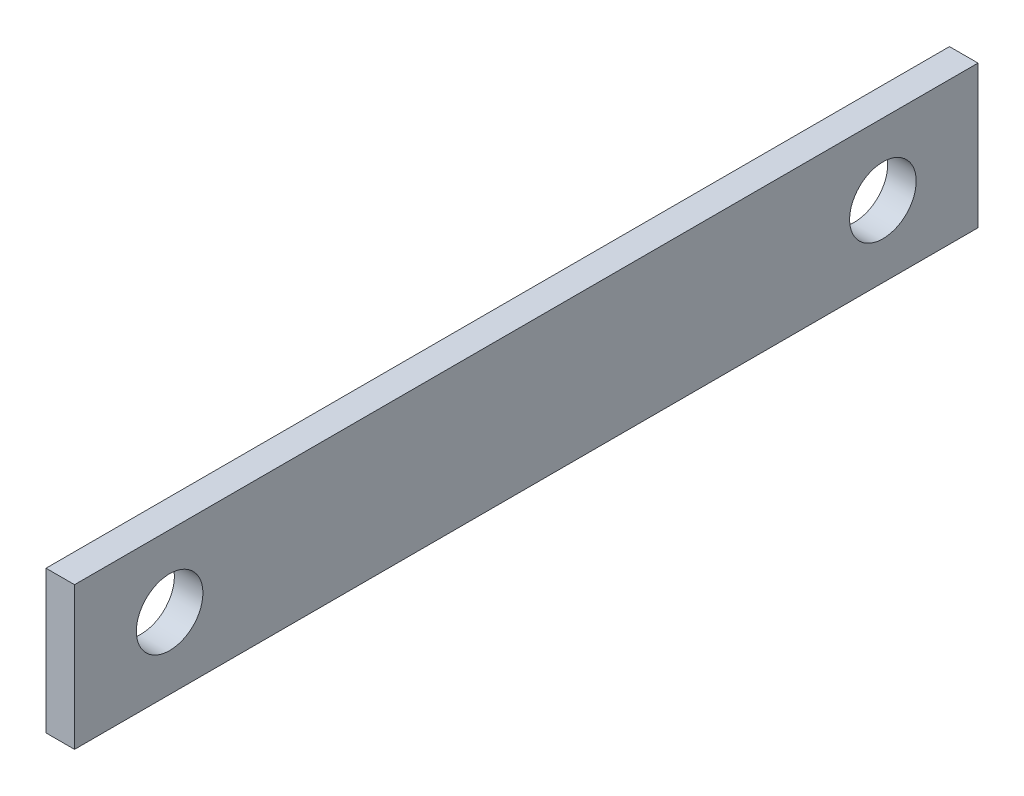
ISO-10303-21;
HEADER;
FILE_DESCRIPTION(('STEP AP214'),'2;1');
FILE_NAME('part.step','',(''),(''),'','','');
FILE_SCHEMA(('AUTOMOTIVE_DESIGN { 1 0 10303 214 1 1 1 1 }'));
ENDSEC;
DATA;
#1=APPLICATION_CONTEXT('core data for automotive mechanical design processes');
#2=APPLICATION_PROTOCOL_DEFINITION('international standard','automotive_design',2000,#1);
#3=PRODUCT_CONTEXT('',#1,'mechanical');
#4=PRODUCT('Part','Part','',(#3));
#5=PRODUCT_RELATED_PRODUCT_CATEGORY('part','',(#4));
#6=PRODUCT_DEFINITION_FORMATION('','',#4);
#7=PRODUCT_DEFINITION_CONTEXT('part definition',#1,'design');
#8=PRODUCT_DEFINITION('design','',#6,#7);
#9=PRODUCT_DEFINITION_SHAPE('','',#8);
#10=(LENGTH_UNIT() NAMED_UNIT(*) SI_UNIT(.MILLI.,.METRE.));
#11=(NAMED_UNIT(*) PLANE_ANGLE_UNIT() SI_UNIT($,.RADIAN.));
#12=(NAMED_UNIT(*) SI_UNIT($,.STERADIAN.) SOLID_ANGLE_UNIT());
#13=UNCERTAINTY_MEASURE_WITH_UNIT(LENGTH_MEASURE(1.E-05),#10,'distance_accuracy_value','');
#14=(GEOMETRIC_REPRESENTATION_CONTEXT(3) GLOBAL_UNCERTAINTY_ASSIGNED_CONTEXT((#13)) GLOBAL_UNIT_ASSIGNED_CONTEXT((#10,
#11,#12)) REPRESENTATION_CONTEXT('',''));
#15=CARTESIAN_POINT('',(0.,0.,0.));
#16=DIRECTION('',(0.,0.,1.));
#17=DIRECTION('',(1.,0.,0.));
#18=AXIS2_PLACEMENT_3D('',#15,#16,#17);
#19=CARTESIAN_POINT('',(6.,0.,0.));
#20=DIRECTION('',(-1.,0.,0.));
#21=DIRECTION('',(0.,0.,1.));
#22=AXIS2_PLACEMENT_3D('',#19,#20,#21);
#23=PLANE('',#22);
#24=DIRECTION('',(0.,1.,0.));
#25=VECTOR('',#24,1.);
#26=CARTESIAN_POINT('',(6.,-15.,-95.));
#27=LINE('',#26,#25);
#28=CARTESIAN_POINT('',(6.,-15.,-95.));
#29=VERTEX_POINT('',#28);
#30=CARTESIAN_POINT('',(6.,15.,-95.));
#31=VERTEX_POINT('',#30);
#32=EDGE_CURVE('E85',#29,#31,#27,.T.);
#33=ORIENTED_EDGE('',*,*,#32,.T.);
#34=DIRECTION('',(0.,0.,1.));
#35=VECTOR('',#34,1.);
#36=CARTESIAN_POINT('',(6.,15.,95.));
#37=LINE('',#36,#35);
#38=CARTESIAN_POINT('',(6.,15.,95.));
#39=VERTEX_POINT('',#38);
#40=EDGE_CURVE('E80',#31,#39,#37,.T.);
#41=ORIENTED_EDGE('',*,*,#40,.T.);
#42=DIRECTION('',(0.,-1.,0.));
#43=VECTOR('',#42,1.);
#44=CARTESIAN_POINT('',(6.,-15.,95.));
#45=LINE('',#44,#43);
#46=CARTESIAN_POINT('',(6.,-15.,95.));
#47=VERTEX_POINT('',#46);
#48=EDGE_CURVE('E83',#39,#47,#45,.T.);
#49=ORIENTED_EDGE('',*,*,#48,.T.);
#50=DIRECTION('',(0.,0.,-1.));
#51=VECTOR('',#50,1.);
#52=CARTESIAN_POINT('',(6.,-15.,95.));
#53=LINE('',#52,#51);
#54=EDGE_CURVE('E50',#47,#29,#53,.T.);
#55=ORIENTED_EDGE('',*,*,#54,.T.);
#56=EDGE_LOOP('',(#33,#41,#49,#55));
#57=FACE_BOUND('',#56,.T.);
#58=CARTESIAN_POINT('',(6.,0.,75.));
#59=DIRECTION('',(1.,0.,0.));
#60=DIRECTION('',(0.,0.,-1.));
#61=AXIS2_PLACEMENT_3D('',#58,#59,#60);
#62=CIRCLE('',#61,7.);
#63=CARTESIAN_POINT('',(6.,0.,68.));
#64=VERTEX_POINT('',#63);
#65=EDGE_CURVE('E100',#64,#64,#62,.T.);
#66=ORIENTED_EDGE('',*,*,#65,.F.);
#67=EDGE_LOOP('',(#66));
#68=FACE_BOUND('',#67,.T.);
#69=CARTESIAN_POINT('',(6.,0.,-75.));
#70=DIRECTION('',(1.,0.,0.));
#71=DIRECTION('',(0.,0.,-1.));
#72=AXIS2_PLACEMENT_3D('',#69,#70,#71);
#73=CIRCLE('',#72,7.);
#74=CARTESIAN_POINT('',(6.,0.,-82.));
#75=VERTEX_POINT('',#74);
#76=EDGE_CURVE('E115',#75,#75,#73,.T.);
#77=ORIENTED_EDGE('',*,*,#76,.F.);
#78=EDGE_LOOP('',(#77));
#79=FACE_BOUND('',#78,.T.);
#80=ADVANCED_FACE('F33',(#57,#68,#79),#23,.F.);
#81=CARTESIAN_POINT('',(0.,0.,0.));
#82=DIRECTION('',(-1.,0.,0.));
#83=DIRECTION('',(0.,0.,1.));
#84=AXIS2_PLACEMENT_3D('',#81,#82,#83);
#85=PLANE('',#84);
#86=CARTESIAN_POINT('',(0.,0.,75.));
#87=DIRECTION('',(1.,0.,0.));
#88=DIRECTION('',(0.,0.,-1.));
#89=AXIS2_PLACEMENT_3D('',#86,#87,#88);
#90=CIRCLE('',#89,7.);
#91=CARTESIAN_POINT('',(0.,0.,68.));
#92=VERTEX_POINT('',#91);
#93=EDGE_CURVE('E112',#92,#92,#90,.T.);
#94=ORIENTED_EDGE('',*,*,#93,.T.);
#95=EDGE_LOOP('',(#94));
#96=FACE_BOUND('',#95,.T.);
#97=DIRECTION('',(0.,1.,0.));
#98=VECTOR('',#97,1.);
#99=CARTESIAN_POINT('',(0.,-15.,-95.));
#100=LINE('',#99,#98);
#101=CARTESIAN_POINT('',(0.,-15.,-95.));
#102=VERTEX_POINT('',#101);
#103=CARTESIAN_POINT('',(0.,15.,-95.));
#104=VERTEX_POINT('',#103);
#105=EDGE_CURVE('E97',#102,#104,#100,.T.);
#106=ORIENTED_EDGE('',*,*,#105,.F.);
#107=DIRECTION('',(0.,0.,-1.));
#108=VECTOR('',#107,1.);
#109=CARTESIAN_POINT('',(0.,-15.,95.));
#110=LINE('',#109,#108);
#111=CARTESIAN_POINT('',(0.,-15.,95.));
#112=VERTEX_POINT('',#111);
#113=EDGE_CURVE('E73',#112,#102,#110,.T.);
#114=ORIENTED_EDGE('',*,*,#113,.F.);
#115=DIRECTION('',(0.,-1.,0.));
#116=VECTOR('',#115,1.);
#117=CARTESIAN_POINT('',(0.,-15.,95.));
#118=LINE('',#117,#116);
#119=CARTESIAN_POINT('',(0.,15.,95.));
#120=VERTEX_POINT('',#119);
#121=EDGE_CURVE('E67',#120,#112,#118,.T.);
#122=ORIENTED_EDGE('',*,*,#121,.F.);
#123=DIRECTION('',(0.,0.,1.));
#124=VECTOR('',#123,1.);
#125=CARTESIAN_POINT('',(0.,15.,95.));
#126=LINE('',#125,#124);
#127=EDGE_CURVE('E89',#104,#120,#126,.T.);
#128=ORIENTED_EDGE('',*,*,#127,.F.);
#129=EDGE_LOOP('',(#106,#114,#122,#128));
#130=FACE_BOUND('',#129,.T.);
#131=CARTESIAN_POINT('',(0.,0.,-75.));
#132=DIRECTION('',(1.,0.,0.));
#133=DIRECTION('',(0.,0.,-1.));
#134=AXIS2_PLACEMENT_3D('',#131,#132,#133);
#135=CIRCLE('',#134,7.);
#136=CARTESIAN_POINT('',(0.,0.,-82.));
#137=VERTEX_POINT('',#136);
#138=EDGE_CURVE('E118',#137,#137,#135,.T.);
#139=ORIENTED_EDGE('',*,*,#138,.T.);
#140=EDGE_LOOP('',(#139));
#141=FACE_BOUND('',#140,.T.);
#142=ADVANCED_FACE('F108',(#96,#130,#141),#85,.T.);
#143=CARTESIAN_POINT('',(6.,-15.,-95.));
#144=DIRECTION('',(0.,0.,1.));
#145=DIRECTION('',(1.,0.,0.));
#146=AXIS2_PLACEMENT_3D('',#143,#144,#145);
#147=PLANE('',#146);
#148=ORIENTED_EDGE('',*,*,#105,.T.);
#149=DIRECTION('',(-1.,0.,0.));
#150=VECTOR('',#149,1.);
#151=CARTESIAN_POINT('',(6.,15.,-95.));
#152=LINE('',#151,#150);
#153=EDGE_CURVE('E11',#31,#104,#152,.T.);
#154=ORIENTED_EDGE('',*,*,#153,.F.);
#155=ORIENTED_EDGE('',*,*,#32,.F.);
#156=DIRECTION('',(-1.,0.,0.));
#157=VECTOR('',#156,1.);
#158=CARTESIAN_POINT('',(6.,-15.,-95.));
#159=LINE('',#158,#157);
#160=EDGE_CURVE('E93',#29,#102,#159,.T.);
#161=ORIENTED_EDGE('',*,*,#160,.T.);
#162=EDGE_LOOP('',(#148,#154,#155,#161));
#163=FACE_BOUND('',#162,.T.);
#164=ADVANCED_FACE('F35',(#163),#147,.F.);
#165=CARTESIAN_POINT('',(6.,15.,95.));
#166=DIRECTION('',(0.,-1.,0.));
#167=DIRECTION('',(0.,0.,-1.));
#168=AXIS2_PLACEMENT_3D('',#165,#166,#167);
#169=PLANE('',#168);
#170=ORIENTED_EDGE('',*,*,#127,.T.);
#171=DIRECTION('',(-1.,0.,0.));
#172=VECTOR('',#171,1.);
#173=CARTESIAN_POINT('',(6.,15.,95.));
#174=LINE('',#173,#172);
#175=EDGE_CURVE('E42',#39,#120,#174,.T.);
#176=ORIENTED_EDGE('',*,*,#175,.F.);
#177=ORIENTED_EDGE('',*,*,#40,.F.);
#178=ORIENTED_EDGE('',*,*,#153,.T.);
#179=EDGE_LOOP('',(#170,#176,#177,#178));
#180=FACE_BOUND('',#179,.T.);
#181=ADVANCED_FACE('F88',(#180),#169,.F.);
#182=CARTESIAN_POINT('',(6.,-15.,95.));
#183=DIRECTION('',(0.,0.,-1.));
#184=DIRECTION('',(-1.,0.,0.));
#185=AXIS2_PLACEMENT_3D('',#182,#183,#184);
#186=PLANE('',#185);
#187=ORIENTED_EDGE('',*,*,#121,.T.);
#188=DIRECTION('',(-1.,0.,0.));
#189=VECTOR('',#188,1.);
#190=CARTESIAN_POINT('',(6.,-15.,95.));
#191=LINE('',#190,#189);
#192=EDGE_CURVE('E90',#47,#112,#191,.T.);
#193=ORIENTED_EDGE('',*,*,#192,.F.);
#194=ORIENTED_EDGE('',*,*,#48,.F.);
#195=ORIENTED_EDGE('',*,*,#175,.T.);
#196=EDGE_LOOP('',(#187,#193,#194,#195));
#197=FACE_BOUND('',#196,.T.);
#198=ADVANCED_FACE('F91',(#197),#186,.F.);
#199=CARTESIAN_POINT('',(6.,-15.,95.));
#200=DIRECTION('',(0.,1.,0.));
#201=DIRECTION('',(0.,0.,1.));
#202=AXIS2_PLACEMENT_3D('',#199,#200,#201);
#203=PLANE('',#202);
#204=ORIENTED_EDGE('',*,*,#113,.T.);
#205=ORIENTED_EDGE('',*,*,#160,.F.);
#206=ORIENTED_EDGE('',*,*,#54,.F.);
#207=ORIENTED_EDGE('',*,*,#192,.T.);
#208=EDGE_LOOP('',(#204,#205,#206,#207));
#209=FACE_BOUND('',#208,.T.);
#210=ADVANCED_FACE('F105',(#209),#203,.F.);
#211=CARTESIAN_POINT('',(6.,0.,75.));
#212=DIRECTION('',(-1.,0.,0.));
#213=DIRECTION('',(0.,0.,1.));
#214=AXIS2_PLACEMENT_3D('',#211,#212,#213);
#215=CYLINDRICAL_SURFACE('',#214,7.);
#216=ORIENTED_EDGE('',*,*,#65,.T.);
#217=EDGE_LOOP('',(#216));
#218=FACE_BOUND('',#217,.T.);
#219=ORIENTED_EDGE('',*,*,#93,.F.);
#220=EDGE_LOOP('',(#219));
#221=FACE_BOUND('',#220,.T.);
#222=ADVANCED_FACE('F135',(#218,#221),#215,.F.);
#223=CARTESIAN_POINT('',(6.,0.,-75.));
#224=DIRECTION('',(-1.,0.,0.));
#225=DIRECTION('',(0.,0.,1.));
#226=AXIS2_PLACEMENT_3D('',#223,#224,#225);
#227=CYLINDRICAL_SURFACE('',#226,7.);
#228=ORIENTED_EDGE('',*,*,#76,.T.);
#229=EDGE_LOOP('',(#228));
#230=FACE_BOUND('',#229,.T.);
#231=ORIENTED_EDGE('',*,*,#138,.F.);
#232=EDGE_LOOP('',(#231));
#233=FACE_BOUND('',#232,.T.);
#234=ADVANCED_FACE('F124',(#230,#233),#227,.F.);
#235=CLOSED_SHELL('',(#80,#142,#164,#181,#198,#210,#222,#234));
#236=MANIFOLD_SOLID_BREP('B2',#235);
#237=ADVANCED_BREP_SHAPE_REPRESENTATION('',(#18,#236),#14);
#238=SHAPE_DEFINITION_REPRESENTATION(#9,#237);
ENDSEC;
END-ISO-10303-21;
